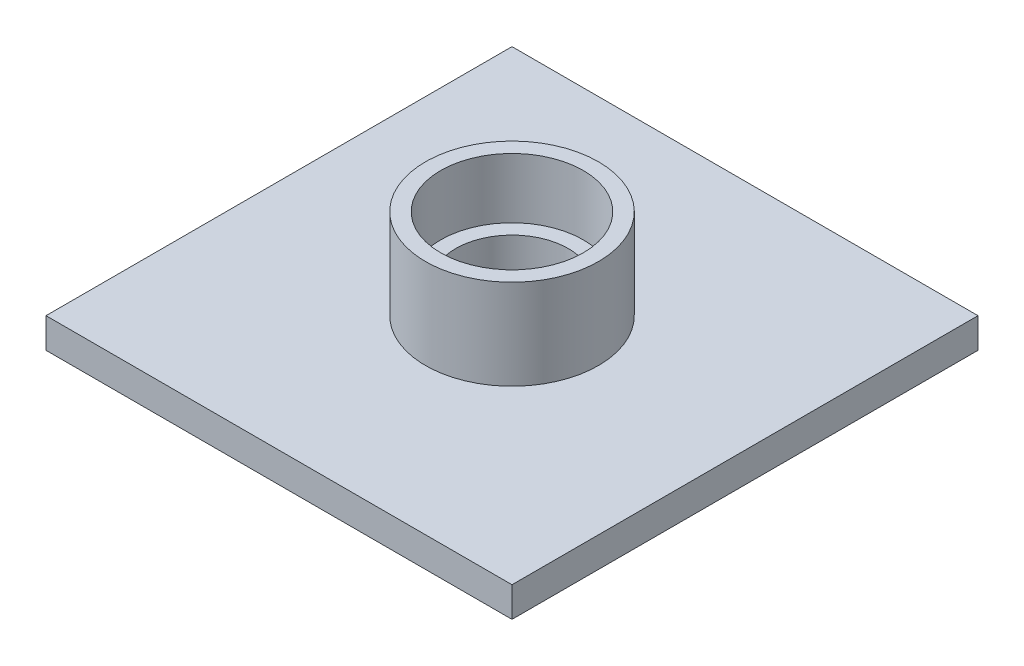
ISO-10303-21;
HEADER;
FILE_DESCRIPTION(('STEP AP214'),'2;1');
FILE_NAME('part.step','',(''),(''),'','','');
FILE_SCHEMA(('AUTOMOTIVE_DESIGN { 1 0 10303 214 1 1 1 1 }'));
ENDSEC;
DATA;
#1=APPLICATION_CONTEXT('core data for automotive mechanical design processes');
#2=APPLICATION_PROTOCOL_DEFINITION('international standard','automotive_design',2000,#1);
#3=PRODUCT_CONTEXT('',#1,'mechanical');
#4=PRODUCT('Part','Part','',(#3));
#5=PRODUCT_RELATED_PRODUCT_CATEGORY('part','',(#4));
#6=PRODUCT_DEFINITION_FORMATION('','',#4);
#7=PRODUCT_DEFINITION_CONTEXT('part definition',#1,'design');
#8=PRODUCT_DEFINITION('design','',#6,#7);
#9=PRODUCT_DEFINITION_SHAPE('','',#8);
#10=(LENGTH_UNIT() NAMED_UNIT(*) SI_UNIT(.MILLI.,.METRE.));
#11=(NAMED_UNIT(*) PLANE_ANGLE_UNIT() SI_UNIT($,.RADIAN.));
#12=(NAMED_UNIT(*) SI_UNIT($,.STERADIAN.) SOLID_ANGLE_UNIT());
#13=UNCERTAINTY_MEASURE_WITH_UNIT(LENGTH_MEASURE(1.E-05),#10,'distance_accuracy_value','');
#14=(GEOMETRIC_REPRESENTATION_CONTEXT(3) GLOBAL_UNCERTAINTY_ASSIGNED_CONTEXT((#13)) GLOBAL_UNIT_ASSIGNED_CONTEXT((#10,
#11,#12)) REPRESENTATION_CONTEXT('',''));
#15=CARTESIAN_POINT('',(0.,0.,0.));
#16=DIRECTION('',(0.,0.,1.));
#17=DIRECTION('',(1.,0.,0.));
#18=AXIS2_PLACEMENT_3D('',#15,#16,#17);
#19=CARTESIAN_POINT('',(0.,50.8,0.));
#20=DIRECTION('',(0.,-1.,0.));
#21=DIRECTION('',(0.,0.,-1.));
#22=AXIS2_PLACEMENT_3D('',#19,#20,#21);
#23=CYLINDRICAL_SURFACE('',#22,36.576);
#24=CARTESIAN_POINT('',(0.,50.8,0.));
#25=DIRECTION('',(0.,-1.,0.));
#26=DIRECTION('',(0.,0.,-1.));
#27=AXIS2_PLACEMENT_3D('',#24,#25,#26);
#28=CIRCLE('',#27,36.576);
#29=CARTESIAN_POINT('',(0.,50.8,-36.576));
#30=VERTEX_POINT('',#29);
#31=EDGE_CURVE('E117',#30,#30,#28,.T.);
#32=ORIENTED_EDGE('',*,*,#31,.T.);
#33=EDGE_LOOP('',(#32));
#34=FACE_BOUND('',#33,.T.);
#35=CARTESIAN_POINT('',(0.,12.7,0.));
#36=DIRECTION('',(0.,-1.,0.));
#37=DIRECTION('',(0.,0.,-1.));
#38=AXIS2_PLACEMENT_3D('',#35,#36,#37);
#39=CIRCLE('',#38,36.576);
#40=CARTESIAN_POINT('',(0.,12.7,-36.576));
#41=VERTEX_POINT('',#40);
#42=EDGE_CURVE('E37',#41,#41,#39,.F.);
#43=ORIENTED_EDGE('',*,*,#42,.T.);
#44=EDGE_LOOP('',(#43));
#45=FACE_BOUND('',#44,.T.);
#46=ADVANCED_FACE('F33',(#34,#45),#23,.T.);
#47=CARTESIAN_POINT('',(0.,25.4,0.));
#48=DIRECTION('',(0.,1.,0.));
#49=DIRECTION('',(0.,0.,1.));
#50=AXIS2_PLACEMENT_3D('',#47,#48,#49);
#51=PLANE('',#50);
#52=CARTESIAN_POINT('',(0.,25.4,0.));
#53=DIRECTION('',(0.,1.,0.));
#54=DIRECTION('',(0.,0.,1.));
#55=AXIS2_PLACEMENT_3D('',#52,#53,#54);
#56=CIRCLE('',#55,30.1625);
#57=CARTESIAN_POINT('',(0.,25.4,30.1625));
#58=VERTEX_POINT('',#57);
#59=EDGE_CURVE('E120',#58,#58,#56,.T.);
#60=ORIENTED_EDGE('',*,*,#59,.T.);
#61=EDGE_LOOP('',(#60));
#62=FACE_BOUND('',#61,.T.);
#63=CARTESIAN_POINT('',(0.,25.4,0.));
#64=DIRECTION('',(0.,1.,0.));
#65=DIRECTION('',(0.,0.,1.));
#66=AXIS2_PLACEMENT_3D('',#63,#64,#65);
#67=CIRCLE('',#66,23.8125);
#68=CARTESIAN_POINT('',(0.,25.4,23.8125));
#69=VERTEX_POINT('',#68);
#70=EDGE_CURVE('E11',#69,#69,#67,.T.);
#71=ORIENTED_EDGE('',*,*,#70,.F.);
#72=EDGE_LOOP('',(#71));
#73=FACE_BOUND('',#72,.T.);
#74=ADVANCED_FACE('F134',(#62,#73),#51,.T.);
#75=CARTESIAN_POINT('',(0.,0.,0.));
#76=DIRECTION('',(0.,1.,0.));
#77=DIRECTION('',(0.,0.,1.));
#78=AXIS2_PLACEMENT_3D('',#75,#76,#77);
#79=PLANE('',#78);
#80=CARTESIAN_POINT('',(0.,0.,0.));
#81=DIRECTION('',(0.,1.,0.));
#82=DIRECTION('',(0.,0.,1.));
#83=AXIS2_PLACEMENT_3D('',#80,#81,#82);
#84=CIRCLE('',#83,23.8125);
#85=CARTESIAN_POINT('',(0.,0.,23.8125));
#86=VERTEX_POINT('',#85);
#87=EDGE_CURVE('E43',#86,#86,#84,.T.);
#88=ORIENTED_EDGE('',*,*,#87,.T.);
#89=EDGE_LOOP('',(#88));
#90=FACE_BOUND('',#89,.T.);
#91=DIRECTION('',(-1.,0.,0.));
#92=VECTOR('',#91,1.);
#93=CARTESIAN_POINT('',(0.,0.,98.552));
#94=LINE('',#93,#92);
#95=CARTESIAN_POINT('',(98.552,0.,98.552));
#96=VERTEX_POINT('',#95);
#97=CARTESIAN_POINT('',(-98.552,0.,98.552));
#98=VERTEX_POINT('',#97);
#99=EDGE_CURVE('E67',#96,#98,#94,.T.);
#100=ORIENTED_EDGE('',*,*,#99,.T.);
#101=DIRECTION('',(0.,0.,-1.));
#102=VECTOR('',#101,1.);
#103=CARTESIAN_POINT('',(-98.552,0.,0.));
#104=LINE('',#103,#102);
#105=CARTESIAN_POINT('',(-98.552,0.,-98.552));
#106=VERTEX_POINT('',#105);
#107=EDGE_CURVE('E74',#98,#106,#104,.T.);
#108=ORIENTED_EDGE('',*,*,#107,.T.);
#109=DIRECTION('',(1.,0.,0.));
#110=VECTOR('',#109,1.);
#111=CARTESIAN_POINT('',(0.,0.,-98.552));
#112=LINE('',#111,#110);
#113=CARTESIAN_POINT('',(98.552,0.,-98.552));
#114=VERTEX_POINT('',#113);
#115=EDGE_CURVE('E106',#106,#114,#112,.T.);
#116=ORIENTED_EDGE('',*,*,#115,.T.);
#117=DIRECTION('',(0.,0.,1.));
#118=VECTOR('',#117,1.);
#119=CARTESIAN_POINT('',(98.552,0.,0.));
#120=LINE('',#119,#118);
#121=EDGE_CURVE('E97',#114,#96,#120,.T.);
#122=ORIENTED_EDGE('',*,*,#121,.T.);
#123=EDGE_LOOP('',(#100,#108,#116,#122));
#124=FACE_BOUND('',#123,.T.);
#125=ADVANCED_FACE('F35',(#90,#124),#79,.F.);
#126=CARTESIAN_POINT('',(0.,25.4,0.));
#127=DIRECTION('',(0.,-1.,0.));
#128=DIRECTION('',(0.,0.,-1.));
#129=AXIS2_PLACEMENT_3D('',#126,#127,#128);
#130=CYLINDRICAL_SURFACE('',#129,23.8125);
#131=ORIENTED_EDGE('',*,*,#87,.F.);
#132=EDGE_LOOP('',(#131));
#133=FACE_BOUND('',#132,.T.);
#134=ORIENTED_EDGE('',*,*,#70,.T.);
#135=EDGE_LOOP('',(#134));
#136=FACE_BOUND('',#135,.T.);
#137=ADVANCED_FACE('F127',(#133,#136),#130,.F.);
#138=CARTESIAN_POINT('',(0.,50.8,0.));
#139=DIRECTION('',(0.,-1.,0.));
#140=DIRECTION('',(0.,0.,-1.));
#141=AXIS2_PLACEMENT_3D('',#138,#139,#140);
#142=PLANE('',#141);
#143=CARTESIAN_POINT('',(0.,50.8,0.));
#144=DIRECTION('',(0.,-1.,0.));
#145=DIRECTION('',(0.,0.,-1.));
#146=AXIS2_PLACEMENT_3D('',#143,#144,#145);
#147=CIRCLE('',#146,30.1625);
#148=CARTESIAN_POINT('',(0.,50.8,-30.1625));
#149=VERTEX_POINT('',#148);
#150=EDGE_CURVE('E114',#149,#149,#147,.T.);
#151=ORIENTED_EDGE('',*,*,#150,.T.);
#152=EDGE_LOOP('',(#151));
#153=FACE_BOUND('',#152,.T.);
#154=ORIENTED_EDGE('',*,*,#31,.F.);
#155=EDGE_LOOP('',(#154));
#156=FACE_BOUND('',#155,.T.);
#157=ADVANCED_FACE('F130',(#153,#156),#142,.F.);
#158=CARTESIAN_POINT('',(0.,50.8,0.));
#159=DIRECTION('',(0.,-1.,0.));
#160=DIRECTION('',(0.,0.,-1.));
#161=AXIS2_PLACEMENT_3D('',#158,#159,#160);
#162=CYLINDRICAL_SURFACE('',#161,30.1625);
#163=ORIENTED_EDGE('',*,*,#59,.F.);
#164=EDGE_LOOP('',(#163));
#165=FACE_BOUND('',#164,.T.);
#166=ORIENTED_EDGE('',*,*,#150,.F.);
#167=EDGE_LOOP('',(#166));
#168=FACE_BOUND('',#167,.T.);
#169=ADVANCED_FACE('F146',(#165,#168),#162,.F.);
#170=CARTESIAN_POINT('',(0.,12.7,98.552));
#171=DIRECTION('',(0.,0.,1.));
#172=DIRECTION('',(1.,0.,0.));
#173=AXIS2_PLACEMENT_3D('',#170,#171,#172);
#174=PLANE('',#173);
#175=ORIENTED_EDGE('',*,*,#99,.F.);
#176=DIRECTION('',(0.,-1.,0.));
#177=VECTOR('',#176,1.);
#178=CARTESIAN_POINT('',(98.552,12.7,98.552));
#179=LINE('',#178,#177);
#180=CARTESIAN_POINT('',(98.552,12.7,98.552));
#181=VERTEX_POINT('',#180);
#182=EDGE_CURVE('E98',#181,#96,#179,.T.);
#183=ORIENTED_EDGE('',*,*,#182,.F.);
#184=DIRECTION('',(-1.,0.,0.));
#185=VECTOR('',#184,1.);
#186=CARTESIAN_POINT('',(0.,12.7,98.552));
#187=LINE('',#186,#185);
#188=CARTESIAN_POINT('',(-98.552,12.7,98.552));
#189=VERTEX_POINT('',#188);
#190=EDGE_CURVE('E52',#181,#189,#187,.T.);
#191=ORIENTED_EDGE('',*,*,#190,.T.);
#192=DIRECTION('',(0.,-1.,0.));
#193=VECTOR('',#192,1.);
#194=CARTESIAN_POINT('',(-98.552,12.7,98.552));
#195=LINE('',#194,#193);
#196=EDGE_CURVE('E110',#189,#98,#195,.T.);
#197=ORIENTED_EDGE('',*,*,#196,.T.);
#198=EDGE_LOOP('',(#175,#183,#191,#197));
#199=FACE_BOUND('',#198,.T.);
#200=ADVANCED_FACE('F150',(#199),#174,.T.);
#201=CARTESIAN_POINT('',(98.552,12.7,0.));
#202=DIRECTION('',(1.,0.,0.));
#203=DIRECTION('',(0.,0.,-1.));
#204=AXIS2_PLACEMENT_3D('',#201,#202,#203);
#205=PLANE('',#204);
#206=ORIENTED_EDGE('',*,*,#121,.F.);
#207=DIRECTION('',(0.,-1.,0.));
#208=VECTOR('',#207,1.);
#209=CARTESIAN_POINT('',(98.552,12.7,-98.552));
#210=LINE('',#209,#208);
#211=CARTESIAN_POINT('',(98.552,12.7,-98.552));
#212=VERTEX_POINT('',#211);
#213=EDGE_CURVE('E87',#212,#114,#210,.T.);
#214=ORIENTED_EDGE('',*,*,#213,.F.);
#215=DIRECTION('',(0.,0.,1.));
#216=VECTOR('',#215,1.);
#217=CARTESIAN_POINT('',(98.552,12.7,0.));
#218=LINE('',#217,#216);
#219=EDGE_CURVE('E92',#212,#181,#218,.T.);
#220=ORIENTED_EDGE('',*,*,#219,.T.);
#221=ORIENTED_EDGE('',*,*,#182,.T.);
#222=EDGE_LOOP('',(#206,#214,#220,#221));
#223=FACE_BOUND('',#222,.T.);
#224=ADVANCED_FACE('F95',(#223),#205,.T.);
#225=CARTESIAN_POINT('',(0.,12.7,-98.552));
#226=DIRECTION('',(0.,0.,-1.));
#227=DIRECTION('',(-1.,0.,0.));
#228=AXIS2_PLACEMENT_3D('',#225,#226,#227);
#229=PLANE('',#228);
#230=ORIENTED_EDGE('',*,*,#115,.F.);
#231=DIRECTION('',(0.,-1.,0.));
#232=VECTOR('',#231,1.);
#233=CARTESIAN_POINT('',(-98.552,12.7,-98.552));
#234=LINE('',#233,#232);
#235=CARTESIAN_POINT('',(-98.552,12.7,-98.552));
#236=VERTEX_POINT('',#235);
#237=EDGE_CURVE('E89',#236,#106,#234,.T.);
#238=ORIENTED_EDGE('',*,*,#237,.F.);
#239=DIRECTION('',(1.,0.,0.));
#240=VECTOR('',#239,1.);
#241=CARTESIAN_POINT('',(0.,12.7,-98.552));
#242=LINE('',#241,#240);
#243=EDGE_CURVE('E84',#236,#212,#242,.T.);
#244=ORIENTED_EDGE('',*,*,#243,.T.);
#245=ORIENTED_EDGE('',*,*,#213,.T.);
#246=EDGE_LOOP('',(#230,#238,#244,#245));
#247=FACE_BOUND('',#246,.T.);
#248=ADVANCED_FACE('F86',(#247),#229,.T.);
#249=CARTESIAN_POINT('',(-98.552,12.7,0.));
#250=DIRECTION('',(-1.,0.,0.));
#251=DIRECTION('',(0.,0.,1.));
#252=AXIS2_PLACEMENT_3D('',#249,#250,#251);
#253=PLANE('',#252);
#254=ORIENTED_EDGE('',*,*,#107,.F.);
#255=ORIENTED_EDGE('',*,*,#196,.F.);
#256=DIRECTION('',(0.,0.,-1.));
#257=VECTOR('',#256,1.);
#258=CARTESIAN_POINT('',(-98.552,12.7,0.));
#259=LINE('',#258,#257);
#260=EDGE_CURVE('E78',#189,#236,#259,.T.);
#261=ORIENTED_EDGE('',*,*,#260,.T.);
#262=ORIENTED_EDGE('',*,*,#237,.T.);
#263=EDGE_LOOP('',(#254,#255,#261,#262));
#264=FACE_BOUND('',#263,.T.);
#265=ADVANCED_FACE('F152',(#264),#253,.T.);
#266=CARTESIAN_POINT('',(0.,12.7,0.));
#267=DIRECTION('',(0.,-1.,0.));
#268=DIRECTION('',(0.,0.,-1.));
#269=AXIS2_PLACEMENT_3D('',#266,#267,#268);
#270=PLANE('',#269);
#271=ORIENTED_EDGE('',*,*,#42,.F.);
#272=EDGE_LOOP('',(#271));
#273=FACE_BOUND('',#272,.T.);
#274=ORIENTED_EDGE('',*,*,#260,.F.);
#275=ORIENTED_EDGE('',*,*,#190,.F.);
#276=ORIENTED_EDGE('',*,*,#219,.F.);
#277=ORIENTED_EDGE('',*,*,#243,.F.);
#278=EDGE_LOOP('',(#274,#275,#276,#277));
#279=FACE_BOUND('',#278,.T.);
#280=ADVANCED_FACE('F100',(#273,#279),#270,.F.);
#281=CLOSED_SHELL('',(#46,#74,#125,#137,#157,#169,#200,#224,#248,#265,#280));
#282=MANIFOLD_SOLID_BREP('B2',#281);
#283=ADVANCED_BREP_SHAPE_REPRESENTATION('',(#18,#282),#14);
#284=SHAPE_DEFINITION_REPRESENTATION(#9,#283);
ENDSEC;
END-ISO-10303-21;
